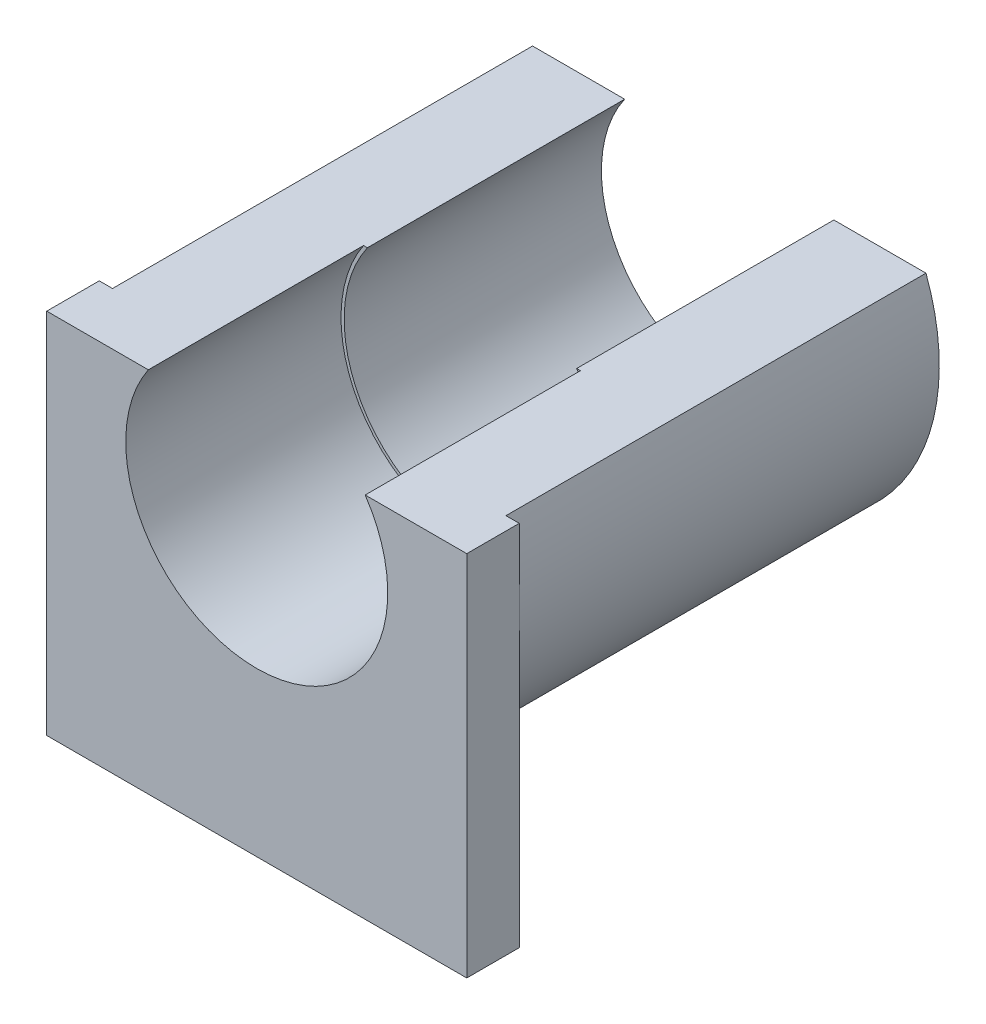
ISO-10303-21;
HEADER;
FILE_DESCRIPTION(('STEP AP214'),'2;1');
FILE_NAME('part.step','',(''),(''),'','','');
FILE_SCHEMA(('AUTOMOTIVE_DESIGN { 1 0 10303 214 1 1 1 1 }'));
ENDSEC;
DATA;
#1=APPLICATION_CONTEXT('core data for automotive mechanical design processes');
#2=APPLICATION_PROTOCOL_DEFINITION('international standard','automotive_design',2000,#1);
#3=PRODUCT_CONTEXT('',#1,'mechanical');
#4=PRODUCT('Part','Part','',(#3));
#5=PRODUCT_RELATED_PRODUCT_CATEGORY('part','',(#4));
#6=PRODUCT_DEFINITION_FORMATION('','',#4);
#7=PRODUCT_DEFINITION_CONTEXT('part definition',#1,'design');
#8=PRODUCT_DEFINITION('design','',#6,#7);
#9=PRODUCT_DEFINITION_SHAPE('','',#8);
#10=(LENGTH_UNIT() NAMED_UNIT(*) SI_UNIT(.MILLI.,.METRE.));
#11=(NAMED_UNIT(*) PLANE_ANGLE_UNIT() SI_UNIT($,.RADIAN.));
#12=(NAMED_UNIT(*) SI_UNIT($,.STERADIAN.) SOLID_ANGLE_UNIT());
#13=UNCERTAINTY_MEASURE_WITH_UNIT(LENGTH_MEASURE(1.E-05),#10,'distance_accuracy_value','');
#14=(GEOMETRIC_REPRESENTATION_CONTEXT(3) GLOBAL_UNCERTAINTY_ASSIGNED_CONTEXT((#13)) GLOBAL_UNIT_ASSIGNED_CONTEXT((#10,
#11,#12)) REPRESENTATION_CONTEXT('',''));
#15=CARTESIAN_POINT('',(0.,0.,0.));
#16=DIRECTION('',(0.,0.,1.));
#17=DIRECTION('',(1.,0.,0.));
#18=AXIS2_PLACEMENT_3D('',#15,#16,#17);
#19=CARTESIAN_POINT('',(0.,10.5,24.5));
#20=DIRECTION('',(0.,0.,1.));
#21=DIRECTION('',(1.,0.,0.));
#22=AXIS2_PLACEMENT_3D('',#19,#20,#21);
#23=PLANE('',#22);
#24=CARTESIAN_POINT('',(0.,10.5,24.5));
#25=DIRECTION('',(0.,0.,1.));
#26=DIRECTION('',(1.,0.,0.));
#27=AXIS2_PLACEMENT_3D('',#24,#25,#26);
#28=CIRCLE('',#27,12.475);
#29=CARTESIAN_POINT('',(-10.3259684775812,17.5,24.5));
#30=VERTEX_POINT('',#29);
#31=CARTESIAN_POINT('',(10.3259684775812,17.5,24.5));
#32=VERTEX_POINT('',#31);
#33=EDGE_CURVE('E21',#30,#32,#28,.T.);
#34=ORIENTED_EDGE('',*,*,#33,.T.);
#35=DIRECTION('',(1.,0.,0.));
#36=VECTOR('',#35,1.);
#37=CARTESIAN_POINT('',(-20.,17.5,24.5));
#38=LINE('',#37,#36);
#39=CARTESIAN_POINT('',(9.96145697174865,17.5,24.5));
#40=VERTEX_POINT('',#39);
#41=EDGE_CURVE('E106',#32,#40,#38,.F.);
#42=ORIENTED_EDGE('',*,*,#41,.T.);
#43=CARTESIAN_POINT('',(0.,10.5,24.5));
#44=DIRECTION('',(0.,0.,1.));
#45=DIRECTION('',(1.,0.,0.));
#46=AXIS2_PLACEMENT_3D('',#43,#44,#45);
#47=CIRCLE('',#46,12.175);
#48=CARTESIAN_POINT('',(-9.96145697174866,17.5,24.5));
#49=VERTEX_POINT('',#48);
#50=EDGE_CURVE('E78',#40,#49,#47,.F.);
#51=ORIENTED_EDGE('',*,*,#50,.T.);
#52=DIRECTION('',(1.,0.,0.));
#53=VECTOR('',#52,1.);
#54=CARTESIAN_POINT('',(0.,17.5,24.5));
#55=LINE('',#54,#53);
#56=EDGE_CURVE('E74',#49,#30,#55,.F.);
#57=ORIENTED_EDGE('',*,*,#56,.T.);
#58=EDGE_LOOP('',(#34,#42,#51,#57));
#59=FACE_BOUND('',#58,.T.);
#60=ADVANCED_FACE('F18',(#59),#23,.T.);
#61=CARTESIAN_POINT('',(0.,10.5,24.5));
#62=DIRECTION('',(0.,0.,1.));
#63=DIRECTION('',(1.,0.,0.));
#64=AXIS2_PLACEMENT_3D('',#61,#62,#63);
#65=CYLINDRICAL_SURFACE('',#64,12.475);
#66=ORIENTED_EDGE('',*,*,#33,.F.);
#67=DIRECTION('',(0.,0.,1.));
#68=VECTOR('',#67,1.);
#69=CARTESIAN_POINT('',(-10.3259684775812,17.5,45.));
#70=LINE('',#69,#68);
#71=CARTESIAN_POINT('',(-10.3259684775812,17.5,45.));
#72=VERTEX_POINT('',#71);
#73=EDGE_CURVE('E87',#30,#72,#70,.T.);
#74=ORIENTED_EDGE('',*,*,#73,.T.);
#75=CARTESIAN_POINT('',(0.,10.5,45.));
#76=DIRECTION('',(0.,0.,1.));
#77=DIRECTION('',(1.,0.,0.));
#78=AXIS2_PLACEMENT_3D('',#75,#76,#77);
#79=CIRCLE('',#78,12.475);
#80=CARTESIAN_POINT('',(10.3259684775812,17.5,45.));
#81=VERTEX_POINT('',#80);
#82=EDGE_CURVE('E92',#81,#72,#79,.F.);
#83=ORIENTED_EDGE('',*,*,#82,.F.);
#84=DIRECTION('',(0.,0.,1.));
#85=VECTOR('',#84,1.);
#86=CARTESIAN_POINT('',(10.3259684775812,17.5,45.));
#87=LINE('',#86,#85);
#88=EDGE_CURVE('E90',#81,#32,#87,.F.);
#89=ORIENTED_EDGE('',*,*,#88,.T.);
#90=EDGE_LOOP('',(#66,#74,#83,#89));
#91=FACE_BOUND('',#90,.T.);
#92=ADVANCED_FACE('F86',(#91),#65,.F.);
#93=CARTESIAN_POINT('',(0.,0.,45.));
#94=DIRECTION('',(0.,0.,1.));
#95=DIRECTION('',(1.,0.,0.));
#96=AXIS2_PLACEMENT_3D('',#93,#94,#95);
#97=PLANE('',#96);
#98=DIRECTION('',(1.,0.,0.));
#99=VECTOR('',#98,1.);
#100=CARTESIAN_POINT('',(-20.,17.5,45.));
#101=LINE('',#100,#99);
#102=CARTESIAN_POINT('',(20.,17.5,45.));
#103=VERTEX_POINT('',#102);
#104=EDGE_CURVE('E116',#103,#81,#101,.F.);
#105=ORIENTED_EDGE('',*,*,#104,.T.);
#106=ORIENTED_EDGE('',*,*,#82,.T.);
#107=DIRECTION('',(1.,0.,0.));
#108=VECTOR('',#107,1.);
#109=CARTESIAN_POINT('',(-20.,17.5,45.));
#110=LINE('',#109,#108);
#111=CARTESIAN_POINT('',(-20.,17.5,45.));
#112=VERTEX_POINT('',#111);
#113=EDGE_CURVE('E97',#72,#112,#110,.F.);
#114=ORIENTED_EDGE('',*,*,#113,.T.);
#115=DIRECTION('',(0.,1.,0.));
#116=VECTOR('',#115,1.);
#117=CARTESIAN_POINT('',(-20.,17.5,45.));
#118=LINE('',#117,#116);
#119=CARTESIAN_POINT('',(-20.,-17.5,45.));
#120=VERTEX_POINT('',#119);
#121=EDGE_CURVE('E131',#112,#120,#118,.F.);
#122=ORIENTED_EDGE('',*,*,#121,.T.);
#123=DIRECTION('',(1.,0.,0.));
#124=VECTOR('',#123,1.);
#125=CARTESIAN_POINT('',(-20.,-17.5,45.));
#126=LINE('',#125,#124);
#127=CARTESIAN_POINT('',(20.,-17.5,45.));
#128=VERTEX_POINT('',#127);
#129=EDGE_CURVE('E127',#120,#128,#126,.T.);
#130=ORIENTED_EDGE('',*,*,#129,.T.);
#131=DIRECTION('',(0.,-1.,0.));
#132=VECTOR('',#131,1.);
#133=CARTESIAN_POINT('',(20.,17.5,45.));
#134=LINE('',#133,#132);
#135=EDGE_CURVE('E121',#128,#103,#134,.F.);
#136=ORIENTED_EDGE('',*,*,#135,.T.);
#137=EDGE_LOOP('',(#105,#106,#114,#122,#130,#136));
#138=FACE_BOUND('',#137,.T.);
#139=ADVANCED_FACE('F152',(#138),#97,.T.);
#140=CARTESIAN_POINT('',(0.,6.50000000000001,40.));
#141=DIRECTION('',(0.,0.,1.));
#142=DIRECTION('',(1.,0.,0.));
#143=AXIS2_PLACEMENT_3D('',#140,#141,#142);
#144=PLANE('',#143);
#145=CARTESIAN_POINT('',(0.,10.5,40.));
#146=DIRECTION('',(0.,0.,-1.));
#147=DIRECTION('',(-1.,0.,0.));
#148=AXIS2_PLACEMENT_3D('',#145,#146,#147);
#149=CIRCLE('',#148,20.);
#150=CARTESIAN_POINT('',(18.7349939951952,17.5,40.));
#151=VERTEX_POINT('',#150);
#152=CARTESIAN_POINT('',(20.,10.5,40.));
#153=VERTEX_POINT('',#152);
#154=EDGE_CURVE('E146',#151,#153,#149,.T.);
#155=ORIENTED_EDGE('',*,*,#154,.F.);
#156=DIRECTION('',(1.,0.,0.));
#157=VECTOR('',#156,1.);
#158=CARTESIAN_POINT('',(-20.,17.5,40.));
#159=LINE('',#158,#157);
#160=CARTESIAN_POINT('',(20.,17.5,40.));
#161=VERTEX_POINT('',#160);
#162=EDGE_CURVE('E108',#151,#161,#159,.T.);
#163=ORIENTED_EDGE('',*,*,#162,.T.);
#164=DIRECTION('',(0.,-1.,0.));
#165=VECTOR('',#164,1.);
#166=CARTESIAN_POINT('',(20.,17.5,40.));
#167=LINE('',#166,#165);
#168=EDGE_CURVE('E124',#161,#153,#167,.T.);
#169=ORIENTED_EDGE('',*,*,#168,.T.);
#170=EDGE_LOOP('',(#155,#163,#169));
#171=FACE_BOUND('',#170,.T.);
#172=ADVANCED_FACE('F337',(#171),#144,.F.);
#173=CARTESIAN_POINT('',(20.,17.5,45.));
#174=DIRECTION('',(-1.,0.,0.));
#175=DIRECTION('',(0.,-1.,0.));
#176=AXIS2_PLACEMENT_3D('',#173,#174,#175);
#177=PLANE('',#176);
#178=DIRECTION('',(0.,1.,0.));
#179=VECTOR('',#178,1.);
#180=CARTESIAN_POINT('',(20.,6.50000000000001,40.));
#181=LINE('',#180,#179);
#182=CARTESIAN_POINT('',(20.,-17.5,40.));
#183=VERTEX_POINT('',#182);
#184=EDGE_CURVE('E235',#183,#153,#181,.T.);
#185=ORIENTED_EDGE('',*,*,#184,.T.);
#186=ORIENTED_EDGE('',*,*,#168,.F.);
#187=DIRECTION('',(0.,0.,1.));
#188=VECTOR('',#187,1.);
#189=CARTESIAN_POINT('',(20.,17.5,45.));
#190=LINE('',#189,#188);
#191=EDGE_CURVE('E109',#161,#103,#190,.T.);
#192=ORIENTED_EDGE('',*,*,#191,.T.);
#193=ORIENTED_EDGE('',*,*,#135,.F.);
#194=DIRECTION('',(0.,0.,1.));
#195=VECTOR('',#194,1.);
#196=CARTESIAN_POINT('',(20.,-17.5,45.));
#197=LINE('',#196,#195);
#198=EDGE_CURVE('E130',#128,#183,#197,.F.);
#199=ORIENTED_EDGE('',*,*,#198,.T.);
#200=EDGE_LOOP('',(#185,#186,#192,#193,#199));
#201=FACE_BOUND('',#200,.T.);
#202=ADVANCED_FACE('F234',(#201),#177,.F.);
#203=CARTESIAN_POINT('',(-20.,17.5,45.));
#204=DIRECTION('',(1.,0.,0.));
#205=DIRECTION('',(0.,1.,0.));
#206=AXIS2_PLACEMENT_3D('',#203,#204,#205);
#207=PLANE('',#206);
#208=DIRECTION('',(0.,1.,0.));
#209=VECTOR('',#208,1.);
#210=CARTESIAN_POINT('',(-20.,6.50000000000001,40.));
#211=LINE('',#210,#209);
#212=CARTESIAN_POINT('',(-20.,17.5,40.));
#213=VERTEX_POINT('',#212);
#214=CARTESIAN_POINT('',(-20.,10.5,40.));
#215=VERTEX_POINT('',#214);
#216=EDGE_CURVE('E36',#213,#215,#211,.F.);
#217=ORIENTED_EDGE('',*,*,#216,.T.);
#218=DIRECTION('',(0.,1.,0.));
#219=VECTOR('',#218,1.);
#220=CARTESIAN_POINT('',(-20.,6.50000000000001,40.));
#221=LINE('',#220,#219);
#222=CARTESIAN_POINT('',(-20.,-17.5,40.));
#223=VERTEX_POINT('',#222);
#224=EDGE_CURVE('E205',#215,#223,#221,.F.);
#225=ORIENTED_EDGE('',*,*,#224,.T.);
#226=DIRECTION('',(0.,0.,1.));
#227=VECTOR('',#226,1.);
#228=CARTESIAN_POINT('',(-20.,-17.5,45.));
#229=LINE('',#228,#227);
#230=EDGE_CURVE('E196',#223,#120,#229,.T.);
#231=ORIENTED_EDGE('',*,*,#230,.T.);
#232=ORIENTED_EDGE('',*,*,#121,.F.);
#233=DIRECTION('',(0.,0.,1.));
#234=VECTOR('',#233,1.);
#235=CARTESIAN_POINT('',(-20.,17.5,45.));
#236=LINE('',#235,#234);
#237=EDGE_CURVE('E100',#112,#213,#236,.F.);
#238=ORIENTED_EDGE('',*,*,#237,.T.);
#239=EDGE_LOOP('',(#217,#225,#231,#232,#238));
#240=FACE_BOUND('',#239,.T.);
#241=ADVANCED_FACE('F225',(#240),#207,.F.);
#242=CARTESIAN_POINT('',(-20.,-17.5,45.));
#243=DIRECTION('',(0.,1.,0.));
#244=DIRECTION('',(0.,0.,1.));
#245=AXIS2_PLACEMENT_3D('',#242,#243,#244);
#246=PLANE('',#245);
#247=DIRECTION('',(1.,0.,0.));
#248=VECTOR('',#247,1.);
#249=CARTESIAN_POINT('',(0.,-17.5,40.));
#250=LINE('',#249,#248);
#251=EDGE_CURVE('E145',#223,#183,#250,.T.);
#252=ORIENTED_EDGE('',*,*,#251,.T.);
#253=ORIENTED_EDGE('',*,*,#198,.F.);
#254=ORIENTED_EDGE('',*,*,#129,.F.);
#255=ORIENTED_EDGE('',*,*,#230,.F.);
#256=EDGE_LOOP('',(#252,#253,#254,#255));
#257=FACE_BOUND('',#256,.T.);
#258=ADVANCED_FACE('F230',(#257),#246,.F.);
#259=CARTESIAN_POINT('',(0.,6.50000000000001,40.));
#260=DIRECTION('',(0.,0.,1.));
#261=DIRECTION('',(1.,0.,0.));
#262=AXIS2_PLACEMENT_3D('',#259,#260,#261);
#263=PLANE('',#262);
#264=ORIENTED_EDGE('',*,*,#216,.F.);
#265=DIRECTION('',(1.,0.,0.));
#266=VECTOR('',#265,1.);
#267=CARTESIAN_POINT('',(-20.,17.5,40.));
#268=LINE('',#267,#266);
#269=CARTESIAN_POINT('',(-18.7349939951952,17.5,40.));
#270=VERTEX_POINT('',#269);
#271=EDGE_CURVE('E150',#213,#270,#268,.T.);
#272=ORIENTED_EDGE('',*,*,#271,.T.);
#273=CARTESIAN_POINT('',(0.,10.5,40.));
#274=DIRECTION('',(0.,0.,-1.));
#275=DIRECTION('',(-1.,0.,0.));
#276=AXIS2_PLACEMENT_3D('',#273,#274,#275);
#277=CIRCLE('',#276,20.);
#278=EDGE_CURVE('E141',#215,#270,#277,.T.);
#279=ORIENTED_EDGE('',*,*,#278,.F.);
#280=EDGE_LOOP('',(#264,#272,#279));
#281=FACE_BOUND('',#280,.T.);
#282=ADVANCED_FACE('F240',(#281),#263,.F.);
#283=CARTESIAN_POINT('',(-20.,17.5,45.));
#284=DIRECTION('',(0.,-1.,0.));
#285=DIRECTION('',(1.,0.,0.));
#286=AXIS2_PLACEMENT_3D('',#283,#284,#285);
#287=PLANE('',#286);
#288=ORIENTED_EDGE('',*,*,#162,.F.);
#289=DIRECTION('',(0.,0.,-1.));
#290=VECTOR('',#289,1.);
#291=CARTESIAN_POINT('',(18.7349939951952,17.5,40.));
#292=LINE('',#291,#290);
#293=CARTESIAN_POINT('',(18.7349939951952,17.5,0.));
#294=VERTEX_POINT('',#293);
#295=EDGE_CURVE('E149',#294,#151,#292,.F.);
#296=ORIENTED_EDGE('',*,*,#295,.F.);
#297=DIRECTION('',(1.,0.,0.));
#298=VECTOR('',#297,1.);
#299=CARTESIAN_POINT('',(0.,17.5,0.));
#300=LINE('',#299,#298);
#301=CARTESIAN_POINT('',(9.96145697174865,17.5,0.));
#302=VERTEX_POINT('',#301);
#303=EDGE_CURVE('E140',#294,#302,#300,.F.);
#304=ORIENTED_EDGE('',*,*,#303,.T.);
#305=DIRECTION('',(0.,0.,1.));
#306=VECTOR('',#305,1.);
#307=CARTESIAN_POINT('',(9.96145697174865,17.5,0.));
#308=LINE('',#307,#306);
#309=EDGE_CURVE('E112',#302,#40,#308,.T.);
#310=ORIENTED_EDGE('',*,*,#309,.T.);
#311=ORIENTED_EDGE('',*,*,#41,.F.);
#312=ORIENTED_EDGE('',*,*,#88,.F.);
#313=ORIENTED_EDGE('',*,*,#104,.F.);
#314=ORIENTED_EDGE('',*,*,#191,.F.);
#315=EDGE_LOOP('',(#288,#296,#304,#310,#311,#312,#313,#314));
#316=FACE_BOUND('',#315,.T.);
#317=ADVANCED_FACE('F160',(#316),#287,.F.);
#318=CARTESIAN_POINT('',(0.,10.5,0.));
#319=DIRECTION('',(0.,0.,1.));
#320=DIRECTION('',(1.,0.,0.));
#321=AXIS2_PLACEMENT_3D('',#318,#319,#320);
#322=CYLINDRICAL_SURFACE('',#321,12.175);
#323=CARTESIAN_POINT('',(0.,10.5,0.));
#324=DIRECTION('',(0.,0.,1.));
#325=DIRECTION('',(1.,0.,0.));
#326=AXIS2_PLACEMENT_3D('',#323,#324,#325);
#327=CIRCLE('',#326,12.175);
#328=CARTESIAN_POINT('',(-9.96145697174866,17.5,0.));
#329=VERTEX_POINT('',#328);
#330=EDGE_CURVE('E137',#302,#329,#327,.F.);
#331=ORIENTED_EDGE('',*,*,#330,.T.);
#332=DIRECTION('',(0.,0.,1.));
#333=VECTOR('',#332,1.);
#334=CARTESIAN_POINT('',(-9.96145697174866,17.5,45.));
#335=LINE('',#334,#333);
#336=EDGE_CURVE('E98',#329,#49,#335,.T.);
#337=ORIENTED_EDGE('',*,*,#336,.T.);
#338=ORIENTED_EDGE('',*,*,#50,.F.);
#339=ORIENTED_EDGE('',*,*,#309,.F.);
#340=EDGE_LOOP('',(#331,#337,#338,#339));
#341=FACE_BOUND('',#340,.T.);
#342=ADVANCED_FACE('F188',(#341),#322,.F.);
#343=CARTESIAN_POINT('',(-20.,17.5,45.));
#344=DIRECTION('',(0.,-1.,0.));
#345=DIRECTION('',(1.,0.,0.));
#346=AXIS2_PLACEMENT_3D('',#343,#344,#345);
#347=PLANE('',#346);
#348=ORIENTED_EDGE('',*,*,#271,.F.);
#349=ORIENTED_EDGE('',*,*,#237,.F.);
#350=ORIENTED_EDGE('',*,*,#113,.F.);
#351=ORIENTED_EDGE('',*,*,#73,.F.);
#352=ORIENTED_EDGE('',*,*,#56,.F.);
#353=ORIENTED_EDGE('',*,*,#336,.F.);
#354=DIRECTION('',(1.,0.,0.));
#355=VECTOR('',#354,1.);
#356=CARTESIAN_POINT('',(0.,17.5,0.));
#357=LINE('',#356,#355);
#358=CARTESIAN_POINT('',(-18.7349939951952,17.5,0.));
#359=VERTEX_POINT('',#358);
#360=EDGE_CURVE('E136',#329,#359,#357,.F.);
#361=ORIENTED_EDGE('',*,*,#360,.T.);
#362=DIRECTION('',(0.,0.,-1.));
#363=VECTOR('',#362,1.);
#364=CARTESIAN_POINT('',(-18.7349939951952,17.5,40.));
#365=LINE('',#364,#363);
#366=EDGE_CURVE('E144',#270,#359,#365,.T.);
#367=ORIENTED_EDGE('',*,*,#366,.F.);
#368=EDGE_LOOP('',(#348,#349,#350,#351,#352,#353,#361,#367));
#369=FACE_BOUND('',#368,.T.);
#370=ADVANCED_FACE('F94',(#369),#347,.F.);
#371=CARTESIAN_POINT('',(0.,6.50000000000001,40.));
#372=DIRECTION('',(0.,0.,1.));
#373=DIRECTION('',(1.,0.,0.));
#374=AXIS2_PLACEMENT_3D('',#371,#372,#373);
#375=PLANE('',#374);
#376=ORIENTED_EDGE('',*,*,#224,.F.);
#377=CARTESIAN_POINT('',(0.,10.5,40.));
#378=DIRECTION('',(0.,0.,-1.));
#379=DIRECTION('',(-1.,0.,0.));
#380=AXIS2_PLACEMENT_3D('',#377,#378,#379);
#381=CIRCLE('',#380,20.);
#382=EDGE_CURVE('E27',#153,#215,#381,.T.);
#383=ORIENTED_EDGE('',*,*,#382,.F.);
#384=ORIENTED_EDGE('',*,*,#184,.F.);
#385=ORIENTED_EDGE('',*,*,#251,.F.);
#386=EDGE_LOOP('',(#376,#383,#384,#385));
#387=FACE_BOUND('',#386,.T.);
#388=ADVANCED_FACE('F247',(#387),#375,.F.);
#389=CARTESIAN_POINT('',(0.,0.,0.));
#390=DIRECTION('',(0.,0.,1.));
#391=DIRECTION('',(1.,0.,0.));
#392=AXIS2_PLACEMENT_3D('',#389,#390,#391);
#393=PLANE('',#392);
#394=CARTESIAN_POINT('',(0.,10.5,0.));
#395=DIRECTION('',(0.,0.,-1.));
#396=DIRECTION('',(-1.,0.,0.));
#397=AXIS2_PLACEMENT_3D('',#394,#395,#396);
#398=CIRCLE('',#397,20.);
#399=EDGE_CURVE('E11',#359,#294,#398,.F.);
#400=ORIENTED_EDGE('',*,*,#399,.F.);
#401=ORIENTED_EDGE('',*,*,#360,.F.);
#402=ORIENTED_EDGE('',*,*,#330,.F.);
#403=ORIENTED_EDGE('',*,*,#303,.F.);
#404=EDGE_LOOP('',(#400,#401,#402,#403));
#405=FACE_BOUND('',#404,.T.);
#406=ADVANCED_FACE('F183',(#405),#393,.F.);
#407=CARTESIAN_POINT('',(0.,10.5,40.));
#408=DIRECTION('',(0.,0.,-1.));
#409=DIRECTION('',(-1.,0.,0.));
#410=AXIS2_PLACEMENT_3D('',#407,#408,#409);
#411=CYLINDRICAL_SURFACE('',#410,20.);
#412=ORIENTED_EDGE('',*,*,#382,.T.);
#413=ORIENTED_EDGE('',*,*,#278,.T.);
#414=ORIENTED_EDGE('',*,*,#366,.T.);
#415=ORIENTED_EDGE('',*,*,#399,.T.);
#416=ORIENTED_EDGE('',*,*,#295,.T.);
#417=ORIENTED_EDGE('',*,*,#154,.T.);
#418=EDGE_LOOP('',(#412,#413,#414,#415,#416,#417));
#419=FACE_BOUND('',#418,.T.);
#420=ADVANCED_FACE('F244',(#419),#411,.T.);
#421=CLOSED_SHELL('',(#60,#92,#139,#172,#202,#241,#258,#282,#317,#342,#370,#388,#406,#420));
#422=MANIFOLD_SOLID_BREP('B1',#421);
#423=ADVANCED_BREP_SHAPE_REPRESENTATION('',(#18,#422),#14);
#424=SHAPE_DEFINITION_REPRESENTATION(#9,#423);
ENDSEC;
END-ISO-10303-21;
